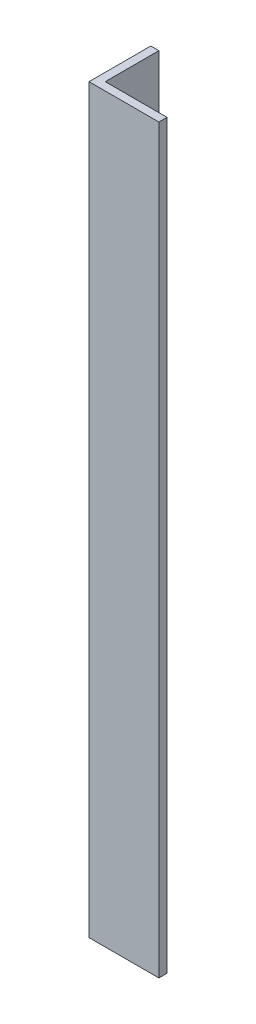
ISO-10303-21;
HEADER;
FILE_DESCRIPTION(('STEP AP214'),'2;1');
FILE_NAME('part.step','',(''),(''),'','','');
FILE_SCHEMA(('AUTOMOTIVE_DESIGN { 1 0 10303 214 1 1 1 1 }'));
ENDSEC;
DATA;
#1=APPLICATION_CONTEXT('core data for automotive mechanical design processes');
#2=APPLICATION_PROTOCOL_DEFINITION('international standard','automotive_design',2000,#1);
#3=PRODUCT_CONTEXT('',#1,'mechanical');
#4=PRODUCT('Part','Part','',(#3));
#5=PRODUCT_RELATED_PRODUCT_CATEGORY('part','',(#4));
#6=PRODUCT_DEFINITION_FORMATION('','',#4);
#7=PRODUCT_DEFINITION_CONTEXT('part definition',#1,'design');
#8=PRODUCT_DEFINITION('design','',#6,#7);
#9=PRODUCT_DEFINITION_SHAPE('','',#8);
#10=(LENGTH_UNIT() NAMED_UNIT(*) SI_UNIT(.MILLI.,.METRE.));
#11=(NAMED_UNIT(*) PLANE_ANGLE_UNIT() SI_UNIT($,.RADIAN.));
#12=(NAMED_UNIT(*) SI_UNIT($,.STERADIAN.) SOLID_ANGLE_UNIT());
#13=UNCERTAINTY_MEASURE_WITH_UNIT(LENGTH_MEASURE(1.E-05),#10,'distance_accuracy_value','');
#14=(GEOMETRIC_REPRESENTATION_CONTEXT(3) GLOBAL_UNCERTAINTY_ASSIGNED_CONTEXT((#13)) GLOBAL_UNIT_ASSIGNED_CONTEXT((#10,
#11,#12)) REPRESENTATION_CONTEXT('',''));
#15=CARTESIAN_POINT('',(0.,0.,0.));
#16=DIRECTION('',(0.,0.,1.));
#17=DIRECTION('',(1.,0.,0.));
#18=AXIS2_PLACEMENT_3D('',#15,#16,#17);
#19=CARTESIAN_POINT('',(38.1,457.2,0.));
#20=DIRECTION('',(-1.,0.,0.));
#21=DIRECTION('',(0.,0.,1.));
#22=AXIS2_PLACEMENT_3D('',#19,#20,#21);
#23=PLANE('',#22);
#24=DIRECTION('',(0.,0.,-1.));
#25=VECTOR('',#24,1.);
#26=CARTESIAN_POINT('',(38.1,0.,0.));
#27=LINE('',#26,#25);
#28=CARTESIAN_POINT('',(38.1,0.,0.));
#29=VERTEX_POINT('',#28);
#30=CARTESIAN_POINT('',(38.1,0.,-5.));
#31=VERTEX_POINT('',#30);
#32=EDGE_CURVE('E122',#29,#31,#27,.T.);
#33=ORIENTED_EDGE('',*,*,#32,.T.);
#34=DIRECTION('',(0.,-1.,0.));
#35=VECTOR('',#34,1.);
#36=CARTESIAN_POINT('',(38.1,457.2,-5.));
#37=LINE('',#36,#35);
#38=CARTESIAN_POINT('',(38.1,457.2,-5.));
#39=VERTEX_POINT('',#38);
#40=EDGE_CURVE('E42',#39,#31,#37,.T.);
#41=ORIENTED_EDGE('',*,*,#40,.F.);
#42=DIRECTION('',(0.,0.,-1.));
#43=VECTOR('',#42,1.);
#44=CARTESIAN_POINT('',(38.1,457.2,0.));
#45=LINE('',#44,#43);
#46=CARTESIAN_POINT('',(38.1,457.2,0.));
#47=VERTEX_POINT('',#46);
#48=EDGE_CURVE('E88',#47,#39,#45,.T.);
#49=ORIENTED_EDGE('',*,*,#48,.F.);
#50=DIRECTION('',(0.,-1.,0.));
#51=VECTOR('',#50,1.);
#52=CARTESIAN_POINT('',(38.1,457.2,0.));
#53=LINE('',#52,#51);
#54=EDGE_CURVE('E11',#47,#29,#53,.T.);
#55=ORIENTED_EDGE('',*,*,#54,.T.);
#56=EDGE_LOOP('',(#33,#41,#49,#55));
#57=FACE_BOUND('',#56,.T.);
#58=ADVANCED_FACE('F34',(#57),#23,.F.);
#59=CARTESIAN_POINT('',(0.,457.2,-5.));
#60=DIRECTION('',(0.,0.,1.));
#61=DIRECTION('',(1.,0.,0.));
#62=AXIS2_PLACEMENT_3D('',#59,#60,#61);
#63=PLANE('',#62);
#64=DIRECTION('',(-1.,0.,0.));
#65=VECTOR('',#64,1.);
#66=CARTESIAN_POINT('',(0.,0.,-5.));
#67=LINE('',#66,#65);
#68=CARTESIAN_POINT('',(0.,0.,-5.));
#69=VERTEX_POINT('',#68);
#70=EDGE_CURVE('E124',#31,#69,#67,.T.);
#71=ORIENTED_EDGE('',*,*,#70,.T.);
#72=DIRECTION('',(0.,-1.,0.));
#73=VECTOR('',#72,1.);
#74=CARTESIAN_POINT('',(0.,457.2,-5.));
#75=LINE('',#74,#73);
#76=CARTESIAN_POINT('',(0.,457.2,-5.));
#77=VERTEX_POINT('',#76);
#78=EDGE_CURVE('E111',#77,#69,#75,.T.);
#79=ORIENTED_EDGE('',*,*,#78,.F.);
#80=DIRECTION('',(-1.,0.,0.));
#81=VECTOR('',#80,1.);
#82=CARTESIAN_POINT('',(0.,457.2,-5.));
#83=LINE('',#82,#81);
#84=EDGE_CURVE('E102',#39,#77,#83,.T.);
#85=ORIENTED_EDGE('',*,*,#84,.F.);
#86=ORIENTED_EDGE('',*,*,#40,.T.);
#87=EDGE_LOOP('',(#71,#79,#85,#86));
#88=FACE_BOUND('',#87,.T.);
#89=ADVANCED_FACE('F136',(#88),#63,.F.);
#90=CARTESIAN_POINT('',(0.,457.2,-5.));
#91=DIRECTION('',(-1.,0.,0.));
#92=DIRECTION('',(0.,0.,1.));
#93=AXIS2_PLACEMENT_3D('',#90,#91,#92);
#94=PLANE('',#93);
#95=DIRECTION('',(0.,0.,-1.));
#96=VECTOR('',#95,1.);
#97=CARTESIAN_POINT('',(0.,0.,-5.));
#98=LINE('',#97,#96);
#99=CARTESIAN_POINT('',(0.,0.,-38.1));
#100=VERTEX_POINT('',#99);
#101=EDGE_CURVE('E110',#69,#100,#98,.T.);
#102=ORIENTED_EDGE('',*,*,#101,.T.);
#103=DIRECTION('',(0.,-1.,0.));
#104=VECTOR('',#103,1.);
#105=CARTESIAN_POINT('',(0.,457.2,-38.1));
#106=LINE('',#105,#104);
#107=CARTESIAN_POINT('',(0.,457.2,-38.1));
#108=VERTEX_POINT('',#107);
#109=EDGE_CURVE('E107',#108,#100,#106,.T.);
#110=ORIENTED_EDGE('',*,*,#109,.F.);
#111=DIRECTION('',(0.,0.,-1.));
#112=VECTOR('',#111,1.);
#113=CARTESIAN_POINT('',(0.,457.2,-5.));
#114=LINE('',#113,#112);
#115=EDGE_CURVE('E96',#77,#108,#114,.T.);
#116=ORIENTED_EDGE('',*,*,#115,.F.);
#117=ORIENTED_EDGE('',*,*,#78,.T.);
#118=EDGE_LOOP('',(#102,#110,#116,#117));
#119=FACE_BOUND('',#118,.T.);
#120=ADVANCED_FACE('F108',(#119),#94,.F.);
#121=CARTESIAN_POINT('',(0.,457.2,-38.1));
#122=DIRECTION('',(0.,0.,1.));
#123=DIRECTION('',(1.,0.,0.));
#124=AXIS2_PLACEMENT_3D('',#121,#122,#123);
#125=PLANE('',#124);
#126=DIRECTION('',(-1.,0.,0.));
#127=VECTOR('',#126,1.);
#128=CARTESIAN_POINT('',(0.,0.,-38.1));
#129=LINE('',#128,#127);
#130=CARTESIAN_POINT('',(-5.,0.,-38.1));
#131=VERTEX_POINT('',#130);
#132=EDGE_CURVE('E74',#100,#131,#129,.T.);
#133=ORIENTED_EDGE('',*,*,#132,.T.);
#134=DIRECTION('',(0.,-1.,0.));
#135=VECTOR('',#134,1.);
#136=CARTESIAN_POINT('',(-5.,457.2,-38.1));
#137=LINE('',#136,#135);
#138=CARTESIAN_POINT('',(-5.,457.2,-38.1));
#139=VERTEX_POINT('',#138);
#140=EDGE_CURVE('E112',#139,#131,#137,.T.);
#141=ORIENTED_EDGE('',*,*,#140,.F.);
#142=DIRECTION('',(-1.,0.,0.));
#143=VECTOR('',#142,1.);
#144=CARTESIAN_POINT('',(0.,457.2,-38.1));
#145=LINE('',#144,#143);
#146=EDGE_CURVE('E100',#108,#139,#145,.T.);
#147=ORIENTED_EDGE('',*,*,#146,.F.);
#148=ORIENTED_EDGE('',*,*,#109,.T.);
#149=EDGE_LOOP('',(#133,#141,#147,#148));
#150=FACE_BOUND('',#149,.T.);
#151=ADVANCED_FACE('F114',(#150),#125,.F.);
#152=CARTESIAN_POINT('',(-5.,457.2,0.));
#153=DIRECTION('',(1.,0.,0.));
#154=DIRECTION('',(0.,0.,-1.));
#155=AXIS2_PLACEMENT_3D('',#152,#153,#154);
#156=PLANE('',#155);
#157=DIRECTION('',(0.,0.,1.));
#158=VECTOR('',#157,1.);
#159=CARTESIAN_POINT('',(-5.,0.,0.));
#160=LINE('',#159,#158);
#161=CARTESIAN_POINT('',(-5.,0.,0.));
#162=VERTEX_POINT('',#161);
#163=EDGE_CURVE('E81',#131,#162,#160,.T.);
#164=ORIENTED_EDGE('',*,*,#163,.T.);
#165=DIRECTION('',(0.,-1.,0.));
#166=VECTOR('',#165,1.);
#167=CARTESIAN_POINT('',(-5.,457.2,0.));
#168=LINE('',#167,#166);
#169=CARTESIAN_POINT('',(-5.,457.2,0.));
#170=VERTEX_POINT('',#169);
#171=EDGE_CURVE('E118',#170,#162,#168,.T.);
#172=ORIENTED_EDGE('',*,*,#171,.F.);
#173=DIRECTION('',(0.,0.,1.));
#174=VECTOR('',#173,1.);
#175=CARTESIAN_POINT('',(-5.,457.2,0.));
#176=LINE('',#175,#174);
#177=EDGE_CURVE('E116',#139,#170,#176,.T.);
#178=ORIENTED_EDGE('',*,*,#177,.F.);
#179=ORIENTED_EDGE('',*,*,#140,.T.);
#180=EDGE_LOOP('',(#164,#172,#178,#179));
#181=FACE_BOUND('',#180,.T.);
#182=ADVANCED_FACE('F142',(#181),#156,.F.);
#183=CARTESIAN_POINT('',(0.,457.2,0.));
#184=DIRECTION('',(0.,0.,-1.));
#185=DIRECTION('',(-1.,0.,0.));
#186=AXIS2_PLACEMENT_3D('',#183,#184,#185);
#187=PLANE('',#186);
#188=DIRECTION('',(1.,0.,0.));
#189=VECTOR('',#188,1.);
#190=CARTESIAN_POINT('',(0.,0.,0.));
#191=LINE('',#190,#189);
#192=EDGE_CURVE('E129',#162,#29,#191,.T.);
#193=ORIENTED_EDGE('',*,*,#192,.T.);
#194=ORIENTED_EDGE('',*,*,#54,.F.);
#195=DIRECTION('',(1.,0.,0.));
#196=VECTOR('',#195,1.);
#197=CARTESIAN_POINT('',(0.,457.2,0.));
#198=LINE('',#197,#196);
#199=EDGE_CURVE('E50',#170,#47,#198,.T.);
#200=ORIENTED_EDGE('',*,*,#199,.F.);
#201=ORIENTED_EDGE('',*,*,#171,.T.);
#202=EDGE_LOOP('',(#193,#194,#200,#201));
#203=FACE_BOUND('',#202,.T.);
#204=ADVANCED_FACE('F141',(#203),#187,.F.);
#205=CARTESIAN_POINT('',(0.,457.2,0.));
#206=DIRECTION('',(0.,1.,0.));
#207=DIRECTION('',(0.,0.,1.));
#208=AXIS2_PLACEMENT_3D('',#205,#206,#207);
#209=PLANE('',#208);
#210=ORIENTED_EDGE('',*,*,#199,.T.);
#211=ORIENTED_EDGE('',*,*,#48,.T.);
#212=ORIENTED_EDGE('',*,*,#84,.T.);
#213=ORIENTED_EDGE('',*,*,#115,.T.);
#214=ORIENTED_EDGE('',*,*,#146,.T.);
#215=ORIENTED_EDGE('',*,*,#177,.T.);
#216=EDGE_LOOP('',(#210,#211,#212,#213,#214,#215));
#217=FACE_BOUND('',#216,.T.);
#218=ADVANCED_FACE('F98',(#217),#209,.T.);
#219=CARTESIAN_POINT('',(0.,0.,0.));
#220=DIRECTION('',(0.,1.,0.));
#221=DIRECTION('',(0.,0.,1.));
#222=AXIS2_PLACEMENT_3D('',#219,#220,#221);
#223=PLANE('',#222);
#224=ORIENTED_EDGE('',*,*,#32,.F.);
#225=ORIENTED_EDGE('',*,*,#192,.F.);
#226=ORIENTED_EDGE('',*,*,#163,.F.);
#227=ORIENTED_EDGE('',*,*,#132,.F.);
#228=ORIENTED_EDGE('',*,*,#101,.F.);
#229=ORIENTED_EDGE('',*,*,#70,.F.);
#230=EDGE_LOOP('',(#224,#225,#226,#227,#228,#229));
#231=FACE_BOUND('',#230,.T.);
#232=ADVANCED_FACE('F139',(#231),#223,.F.);
#233=CLOSED_SHELL('',(#58,#89,#120,#151,#182,#204,#218,#232));
#234=MANIFOLD_SOLID_BREP('B2',#233);
#235=ADVANCED_BREP_SHAPE_REPRESENTATION('',(#18,#234),#14);
#236=SHAPE_DEFINITION_REPRESENTATION(#9,#235);
ENDSEC;
END-ISO-10303-21;
